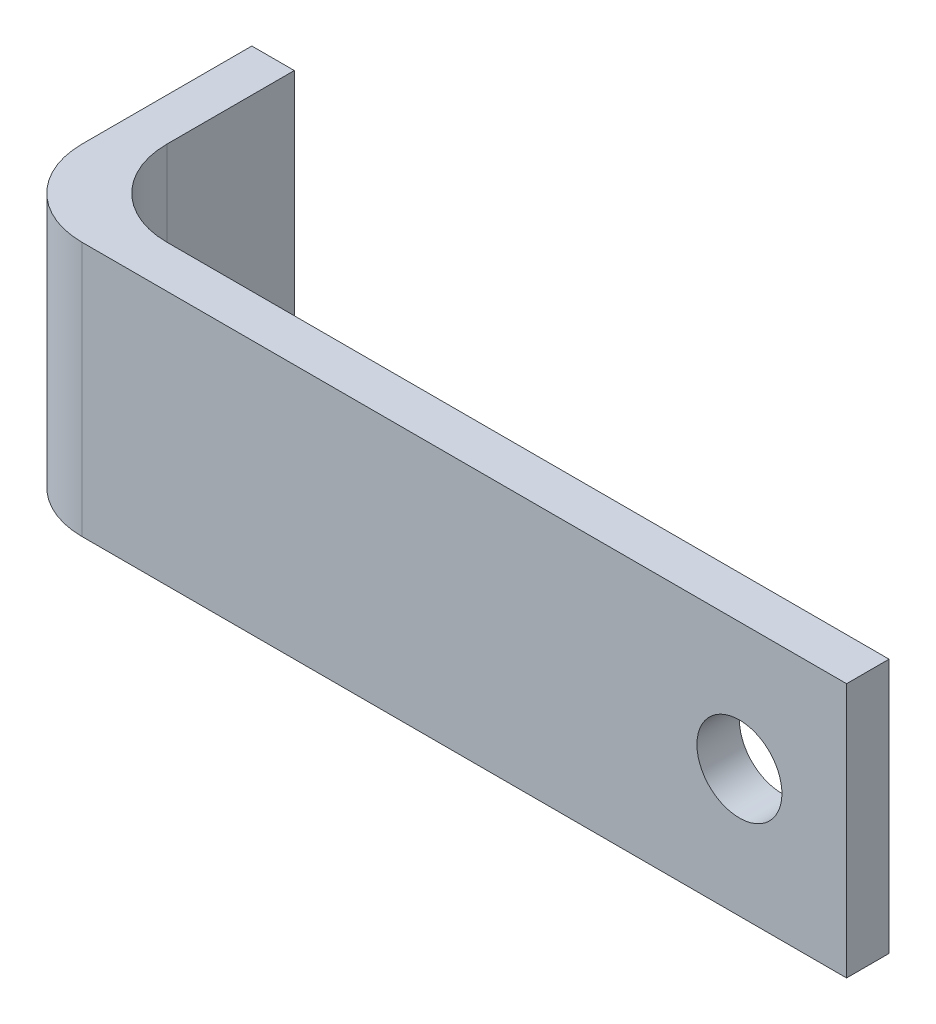
ISO-10303-21;
HEADER;
FILE_DESCRIPTION(('STEP AP214'),'2;1');
FILE_NAME('part.step','',(''),(''),'','','');
FILE_SCHEMA(('AUTOMOTIVE_DESIGN { 1 0 10303 214 1 1 1 1 }'));
ENDSEC;
DATA;
#1=APPLICATION_CONTEXT('core data for automotive mechanical design processes');
#2=APPLICATION_PROTOCOL_DEFINITION('international standard','automotive_design',2000,#1);
#3=PRODUCT_CONTEXT('',#1,'mechanical');
#4=PRODUCT('Part','Part','',(#3));
#5=PRODUCT_RELATED_PRODUCT_CATEGORY('part','',(#4));
#6=PRODUCT_DEFINITION_FORMATION('','',#4);
#7=PRODUCT_DEFINITION_CONTEXT('part definition',#1,'design');
#8=PRODUCT_DEFINITION('design','',#6,#7);
#9=PRODUCT_DEFINITION_SHAPE('','',#8);
#10=(LENGTH_UNIT() NAMED_UNIT(*) SI_UNIT(.MILLI.,.METRE.));
#11=(NAMED_UNIT(*) PLANE_ANGLE_UNIT() SI_UNIT($,.RADIAN.));
#12=(NAMED_UNIT(*) SI_UNIT($,.STERADIAN.) SOLID_ANGLE_UNIT());
#13=UNCERTAINTY_MEASURE_WITH_UNIT(LENGTH_MEASURE(1.E-05),#10,'distance_accuracy_value','');
#14=(GEOMETRIC_REPRESENTATION_CONTEXT(3) GLOBAL_UNCERTAINTY_ASSIGNED_CONTEXT((#13)) GLOBAL_UNIT_ASSIGNED_CONTEXT((#10,
#11,#12)) REPRESENTATION_CONTEXT('',''));
#15=CARTESIAN_POINT('',(0.,0.,0.));
#16=DIRECTION('',(0.,0.,1.));
#17=DIRECTION('',(1.,0.,0.));
#18=AXIS2_PLACEMENT_3D('',#15,#16,#17);
#19=CARTESIAN_POINT('',(-57.3474178403756,15.,9.60093896713609));
#20=DIRECTION('',(1.,0.,0.));
#21=DIRECTION('',(0.,0.,-1.));
#22=AXIS2_PLACEMENT_3D('',#19,#20,#21);
#23=PLANE('',#22);
#24=CARTESIAN_POINT('',(-57.3474178403756,0.,0.));
#25=DIRECTION('',(1.,0.,0.));
#26=DIRECTION('',(0.,0.,-1.));
#27=AXIS2_PLACEMENT_3D('',#24,#25,#26);
#28=CIRCLE('',#27,2.5);
#29=CARTESIAN_POINT('',(-57.3474178403756,0.,-2.49999999999998));
#30=VERTEX_POINT('',#29);
#31=EDGE_CURVE('E11',#30,#30,#28,.F.);
#32=ORIENTED_EDGE('',*,*,#31,.F.);
#33=EDGE_LOOP('',(#32));
#34=FACE_BOUND('',#33,.T.);
#35=DIRECTION('',(0.,0.,1.));
#36=VECTOR('',#35,1.);
#37=CARTESIAN_POINT('',(-57.3474178403756,-15.,9.60093896713609));
#38=LINE('',#37,#36);
#39=CARTESIAN_POINT('',(-57.3474178403756,-15.,-10.3990610328638));
#40=VERTEX_POINT('',#39);
#41=CARTESIAN_POINT('',(-57.3474178403756,-15.,9.60093896713609));
#42=VERTEX_POINT('',#41);
#43=EDGE_CURVE('E141',#40,#42,#38,.T.);
#44=ORIENTED_EDGE('',*,*,#43,.T.);
#45=DIRECTION('',(0.,-1.,0.));
#46=VECTOR('',#45,1.);
#47=CARTESIAN_POINT('',(-57.3474178403756,15.,9.60093896713609));
#48=LINE('',#47,#46);
#49=CARTESIAN_POINT('',(-57.3474178403756,15.,9.60093896713609));
#50=VERTEX_POINT('',#49);
#51=EDGE_CURVE('E48',#50,#42,#48,.T.);
#52=ORIENTED_EDGE('',*,*,#51,.F.);
#53=DIRECTION('',(0.,0.,1.));
#54=VECTOR('',#53,1.);
#55=CARTESIAN_POINT('',(-57.3474178403756,15.,9.60093896713609));
#56=LINE('',#55,#54);
#57=CARTESIAN_POINT('',(-57.3474178403756,15.,-10.3990610328638));
#58=VERTEX_POINT('',#57);
#59=EDGE_CURVE('E164',#58,#50,#56,.T.);
#60=ORIENTED_EDGE('',*,*,#59,.F.);
#61=DIRECTION('',(0.,-1.,0.));
#62=VECTOR('',#61,1.);
#63=CARTESIAN_POINT('',(-57.3474178403756,15.,-10.3990610328638));
#64=LINE('',#63,#62);
#65=EDGE_CURVE('E137',#58,#40,#64,.T.);
#66=ORIENTED_EDGE('',*,*,#65,.T.);
#67=EDGE_LOOP('',(#44,#52,#60,#66));
#68=FACE_BOUND('',#67,.T.);
#69=ADVANCED_FACE('F39',(#34,#68),#23,.F.);
#70=CARTESIAN_POINT('',(-47.3474178403756,15.,9.60093896713616));
#71=DIRECTION('',(0.,-1.,0.));
#72=DIRECTION('',(0.,0.,-1.));
#73=AXIS2_PLACEMENT_3D('',#70,#71,#72);
#74=CYLINDRICAL_SURFACE('',#73,10.);
#75=CARTESIAN_POINT('',(-47.3474178403756,-15.,9.60093896713616));
#76=DIRECTION('',(0.,1.,0.));
#77=DIRECTION('',(0.,0.,1.));
#78=AXIS2_PLACEMENT_3D('',#75,#76,#77);
#79=CIRCLE('',#78,10.);
#80=CARTESIAN_POINT('',(-47.3474178403755,-15.,19.6009389671362));
#81=VERTEX_POINT('',#80);
#82=EDGE_CURVE('E145',#42,#81,#79,.T.);
#83=ORIENTED_EDGE('',*,*,#82,.T.);
#84=DIRECTION('',(0.,-1.,0.));
#85=VECTOR('',#84,1.);
#86=CARTESIAN_POINT('',(-47.3474178403755,15.,19.6009389671362));
#87=LINE('',#86,#85);
#88=CARTESIAN_POINT('',(-47.3474178403755,15.,19.6009389671362));
#89=VERTEX_POINT('',#88);
#90=EDGE_CURVE('E179',#89,#81,#87,.T.);
#91=ORIENTED_EDGE('',*,*,#90,.F.);
#92=CARTESIAN_POINT('',(-47.3474178403756,15.,9.60093896713616));
#93=DIRECTION('',(0.,1.,0.));
#94=DIRECTION('',(0.,0.,1.));
#95=AXIS2_PLACEMENT_3D('',#92,#93,#94);
#96=CIRCLE('',#95,10.);
#97=EDGE_CURVE('E100',#50,#89,#96,.T.);
#98=ORIENTED_EDGE('',*,*,#97,.F.);
#99=ORIENTED_EDGE('',*,*,#51,.T.);
#100=EDGE_LOOP('',(#83,#91,#98,#99));
#101=FACE_BOUND('',#100,.T.);
#102=ADVANCED_FACE('F184',(#101),#74,.T.);
#103=CARTESIAN_POINT('',(42.6525821596244,15.,19.6009389671362));
#104=DIRECTION('',(0.,0.,-1.));
#105=DIRECTION('',(-1.,0.,0.));
#106=AXIS2_PLACEMENT_3D('',#103,#104,#105);
#107=PLANE('',#106);
#108=CARTESIAN_POINT('',(30.0407994786376,0.,19.6009389671362));
#109=DIRECTION('',(0.,0.,-1.));
#110=DIRECTION('',(-1.,0.,0.));
#111=AXIS2_PLACEMENT_3D('',#108,#109,#110);
#112=CIRCLE('',#111,5.);
#113=CARTESIAN_POINT('',(25.0407994786376,0.,19.6009389671362));
#114=VERTEX_POINT('',#113);
#115=EDGE_CURVE('E146',#114,#114,#112,.T.);
#116=ORIENTED_EDGE('',*,*,#115,.T.);
#117=EDGE_LOOP('',(#116));
#118=FACE_BOUND('',#117,.T.);
#119=DIRECTION('',(1.,0.,0.));
#120=VECTOR('',#119,1.);
#121=CARTESIAN_POINT('',(42.6525821596244,-15.,19.6009389671362));
#122=LINE('',#121,#120);
#123=CARTESIAN_POINT('',(42.6525821596244,-15.,19.6009389671362));
#124=VERTEX_POINT('',#123);
#125=EDGE_CURVE('E149',#81,#124,#122,.T.);
#126=ORIENTED_EDGE('',*,*,#125,.T.);
#127=DIRECTION('',(0.,-1.,0.));
#128=VECTOR('',#127,1.);
#129=CARTESIAN_POINT('',(42.6525821596244,15.,19.6009389671362));
#130=LINE('',#129,#128);
#131=CARTESIAN_POINT('',(42.6525821596244,15.,19.6009389671362));
#132=VERTEX_POINT('',#131);
#133=EDGE_CURVE('E175',#132,#124,#130,.T.);
#134=ORIENTED_EDGE('',*,*,#133,.F.);
#135=DIRECTION('',(1.,0.,0.));
#136=VECTOR('',#135,1.);
#137=CARTESIAN_POINT('',(42.6525821596244,15.,19.6009389671362));
#138=LINE('',#137,#136);
#139=EDGE_CURVE('E203',#89,#132,#138,.T.);
#140=ORIENTED_EDGE('',*,*,#139,.F.);
#141=ORIENTED_EDGE('',*,*,#90,.T.);
#142=EDGE_LOOP('',(#126,#134,#140,#141));
#143=FACE_BOUND('',#142,.T.);
#144=ADVANCED_FACE('F195',(#118,#143),#107,.F.);
#145=CARTESIAN_POINT('',(42.6525821596244,15.,14.6009389671362));
#146=DIRECTION('',(-1.,0.,0.));
#147=DIRECTION('',(0.,0.,1.));
#148=AXIS2_PLACEMENT_3D('',#145,#146,#147);
#149=PLANE('',#148);
#150=DIRECTION('',(0.,0.,-1.));
#151=VECTOR('',#150,1.);
#152=CARTESIAN_POINT('',(42.6525821596244,-15.,14.6009389671362));
#153=LINE('',#152,#151);
#154=CARTESIAN_POINT('',(42.6525821596244,-15.,14.6009389671362));
#155=VERTEX_POINT('',#154);
#156=EDGE_CURVE('E152',#124,#155,#153,.T.);
#157=ORIENTED_EDGE('',*,*,#156,.T.);
#158=DIRECTION('',(0.,-1.,0.));
#159=VECTOR('',#158,1.);
#160=CARTESIAN_POINT('',(42.6525821596244,15.,14.6009389671362));
#161=LINE('',#160,#159);
#162=CARTESIAN_POINT('',(42.6525821596244,15.,14.6009389671362));
#163=VERTEX_POINT('',#162);
#164=EDGE_CURVE('E171',#163,#155,#161,.T.);
#165=ORIENTED_EDGE('',*,*,#164,.F.);
#166=DIRECTION('',(0.,0.,-1.));
#167=VECTOR('',#166,1.);
#168=CARTESIAN_POINT('',(42.6525821596244,15.,14.6009389671362));
#169=LINE('',#168,#167);
#170=EDGE_CURVE('E201',#132,#163,#169,.T.);
#171=ORIENTED_EDGE('',*,*,#170,.F.);
#172=ORIENTED_EDGE('',*,*,#133,.T.);
#173=EDGE_LOOP('',(#157,#165,#171,#172));
#174=FACE_BOUND('',#173,.T.);
#175=ADVANCED_FACE('F199',(#174),#149,.F.);
#176=CARTESIAN_POINT('',(-42.3474178403755,15.,14.6009389671362));
#177=DIRECTION('',(0.,0.,1.));
#178=DIRECTION('',(1.,0.,0.));
#179=AXIS2_PLACEMENT_3D('',#176,#177,#178);
#180=PLANE('',#179);
#181=CARTESIAN_POINT('',(30.0407994786376,0.,14.6009389671362));
#182=DIRECTION('',(0.,0.,-1.));
#183=DIRECTION('',(-1.,0.,0.));
#184=AXIS2_PLACEMENT_3D('',#181,#182,#183);
#185=CIRCLE('',#184,5.);
#186=CARTESIAN_POINT('',(25.0407994786376,0.,14.6009389671362));
#187=VERTEX_POINT('',#186);
#188=EDGE_CURVE('E216',#187,#187,#185,.T.);
#189=ORIENTED_EDGE('',*,*,#188,.F.);
#190=EDGE_LOOP('',(#189));
#191=FACE_BOUND('',#190,.T.);
#192=DIRECTION('',(-1.,0.,0.));
#193=VECTOR('',#192,1.);
#194=CARTESIAN_POINT('',(-42.3474178403755,-15.,14.6009389671362));
#195=LINE('',#194,#193);
#196=CARTESIAN_POINT('',(-42.3474178403756,-15.,14.6009389671362));
#197=VERTEX_POINT('',#196);
#198=EDGE_CURVE('E155',#155,#197,#195,.T.);
#199=ORIENTED_EDGE('',*,*,#198,.T.);
#200=DIRECTION('',(0.,-1.,0.));
#201=VECTOR('',#200,1.);
#202=CARTESIAN_POINT('',(-42.3474178403756,15.,14.6009389671362));
#203=LINE('',#202,#201);
#204=CARTESIAN_POINT('',(-42.3474178403756,15.,14.6009389671362));
#205=VERTEX_POINT('',#204);
#206=EDGE_CURVE('E130',#205,#197,#203,.T.);
#207=ORIENTED_EDGE('',*,*,#206,.F.);
#208=DIRECTION('',(-1.,0.,0.));
#209=VECTOR('',#208,1.);
#210=CARTESIAN_POINT('',(-42.3474178403755,15.,14.6009389671362));
#211=LINE('',#210,#209);
#212=EDGE_CURVE('E119',#163,#205,#211,.T.);
#213=ORIENTED_EDGE('',*,*,#212,.F.);
#214=ORIENTED_EDGE('',*,*,#164,.T.);
#215=EDGE_LOOP('',(#199,#207,#213,#214));
#216=FACE_BOUND('',#215,.T.);
#217=ADVANCED_FACE('F246',(#191,#216),#180,.F.);
#218=CARTESIAN_POINT('',(-42.3474178403756,15.,4.60093896713615));
#219=DIRECTION('',(0.,-1.,0.));
#220=DIRECTION('',(0.,0.,-1.));
#221=AXIS2_PLACEMENT_3D('',#218,#219,#220);
#222=CYLINDRICAL_SURFACE('',#221,10.);
#223=CARTESIAN_POINT('',(-42.3474178403756,-15.,4.60093896713615));
#224=DIRECTION('',(0.,-1.,0.));
#225=DIRECTION('',(0.,0.,1.));
#226=AXIS2_PLACEMENT_3D('',#223,#224,#225);
#227=CIRCLE('',#226,10.);
#228=CARTESIAN_POINT('',(-52.3474178403756,-15.,4.60093896713609));
#229=VERTEX_POINT('',#228);
#230=EDGE_CURVE('E128',#197,#229,#227,.T.);
#231=ORIENTED_EDGE('',*,*,#230,.T.);
#232=DIRECTION('',(0.,-1.,0.));
#233=VECTOR('',#232,1.);
#234=CARTESIAN_POINT('',(-52.3474178403756,15.,4.60093896713609));
#235=LINE('',#234,#233);
#236=CARTESIAN_POINT('',(-52.3474178403756,15.,4.60093896713609));
#237=VERTEX_POINT('',#236);
#238=EDGE_CURVE('E125',#237,#229,#235,.T.);
#239=ORIENTED_EDGE('',*,*,#238,.F.);
#240=CARTESIAN_POINT('',(-42.3474178403756,15.,4.60093896713615));
#241=DIRECTION('',(0.,-1.,0.));
#242=DIRECTION('',(0.,0.,1.));
#243=AXIS2_PLACEMENT_3D('',#240,#241,#242);
#244=CIRCLE('',#243,10.);
#245=EDGE_CURVE('E113',#205,#237,#244,.T.);
#246=ORIENTED_EDGE('',*,*,#245,.F.);
#247=ORIENTED_EDGE('',*,*,#206,.T.);
#248=EDGE_LOOP('',(#231,#239,#246,#247));
#249=FACE_BOUND('',#248,.T.);
#250=ADVANCED_FACE('F126',(#249),#222,.F.);
#251=CARTESIAN_POINT('',(-52.3474178403756,15.,-10.3990610328638));
#252=DIRECTION('',(-1.,0.,0.));
#253=DIRECTION('',(0.,0.,1.));
#254=AXIS2_PLACEMENT_3D('',#251,#252,#253);
#255=PLANE('',#254);
#256=DIRECTION('',(0.,0.,-1.));
#257=VECTOR('',#256,1.);
#258=CARTESIAN_POINT('',(-52.3474178403756,-15.,-10.3990610328638));
#259=LINE('',#258,#257);
#260=CARTESIAN_POINT('',(-52.3474178403756,-15.,-10.3990610328638));
#261=VERTEX_POINT('',#260);
#262=EDGE_CURVE('E85',#229,#261,#259,.T.);
#263=ORIENTED_EDGE('',*,*,#262,.T.);
#264=DIRECTION('',(0.,-1.,0.));
#265=VECTOR('',#264,1.);
#266=CARTESIAN_POINT('',(-52.3474178403756,15.,-10.3990610328638));
#267=LINE('',#266,#265);
#268=CARTESIAN_POINT('',(-52.3474178403756,15.,-10.3990610328638));
#269=VERTEX_POINT('',#268);
#270=EDGE_CURVE('E131',#269,#261,#267,.T.);
#271=ORIENTED_EDGE('',*,*,#270,.F.);
#272=DIRECTION('',(0.,0.,-1.));
#273=VECTOR('',#272,1.);
#274=CARTESIAN_POINT('',(-52.3474178403756,15.,-10.3990610328638));
#275=LINE('',#274,#273);
#276=EDGE_CURVE('E117',#237,#269,#275,.T.);
#277=ORIENTED_EDGE('',*,*,#276,.F.);
#278=ORIENTED_EDGE('',*,*,#238,.T.);
#279=EDGE_LOOP('',(#263,#271,#277,#278));
#280=FACE_BOUND('',#279,.T.);
#281=ADVANCED_FACE('F133',(#280),#255,.F.);
#282=CARTESIAN_POINT('',(-57.3474178403756,15.,-10.3990610328638));
#283=DIRECTION('',(0.,0.,1.));
#284=DIRECTION('',(1.,0.,0.));
#285=AXIS2_PLACEMENT_3D('',#282,#283,#284);
#286=PLANE('',#285);
#287=DIRECTION('',(-1.,0.,0.));
#288=VECTOR('',#287,1.);
#289=CARTESIAN_POINT('',(-57.3474178403756,-15.,-10.3990610328638));
#290=LINE('',#289,#288);
#291=EDGE_CURVE('E91',#261,#40,#290,.T.);
#292=ORIENTED_EDGE('',*,*,#291,.T.);
#293=ORIENTED_EDGE('',*,*,#65,.F.);
#294=DIRECTION('',(-1.,0.,0.));
#295=VECTOR('',#294,1.);
#296=CARTESIAN_POINT('',(-57.3474178403756,15.,-10.3990610328638));
#297=LINE('',#296,#295);
#298=EDGE_CURVE('E56',#269,#58,#297,.T.);
#299=ORIENTED_EDGE('',*,*,#298,.F.);
#300=ORIENTED_EDGE('',*,*,#270,.T.);
#301=EDGE_LOOP('',(#292,#293,#299,#300));
#302=FACE_BOUND('',#301,.T.);
#303=ADVANCED_FACE('F254',(#302),#286,.F.);
#304=CARTESIAN_POINT('',(-42.3474178403756,15.,4.60093896713615));
#305=DIRECTION('',(0.,1.,0.));
#306=DIRECTION('',(0.,0.,1.));
#307=AXIS2_PLACEMENT_3D('',#304,#305,#306);
#308=PLANE('',#307);
#309=ORIENTED_EDGE('',*,*,#59,.T.);
#310=ORIENTED_EDGE('',*,*,#97,.T.);
#311=ORIENTED_EDGE('',*,*,#139,.T.);
#312=ORIENTED_EDGE('',*,*,#170,.T.);
#313=ORIENTED_EDGE('',*,*,#212,.T.);
#314=ORIENTED_EDGE('',*,*,#245,.T.);
#315=ORIENTED_EDGE('',*,*,#276,.T.);
#316=ORIENTED_EDGE('',*,*,#298,.T.);
#317=EDGE_LOOP('',(#309,#310,#311,#312,#313,#314,#315,#316));
#318=FACE_BOUND('',#317,.T.);
#319=ADVANCED_FACE('F115',(#318),#308,.T.);
#320=CARTESIAN_POINT('',(-42.3474178403756,-15.,4.60093896713615));
#321=DIRECTION('',(0.,1.,0.));
#322=DIRECTION('',(0.,0.,1.));
#323=AXIS2_PLACEMENT_3D('',#320,#321,#322);
#324=PLANE('',#323);
#325=ORIENTED_EDGE('',*,*,#43,.F.);
#326=ORIENTED_EDGE('',*,*,#291,.F.);
#327=ORIENTED_EDGE('',*,*,#262,.F.);
#328=ORIENTED_EDGE('',*,*,#230,.F.);
#329=ORIENTED_EDGE('',*,*,#198,.F.);
#330=ORIENTED_EDGE('',*,*,#156,.F.);
#331=ORIENTED_EDGE('',*,*,#125,.F.);
#332=ORIENTED_EDGE('',*,*,#82,.F.);
#333=EDGE_LOOP('',(#325,#326,#327,#328,#329,#330,#331,#332));
#334=FACE_BOUND('',#333,.T.);
#335=ADVANCED_FACE('F189',(#334),#324,.F.);
#336=CARTESIAN_POINT('',(30.0407994786376,0.,44.6009389671362));
#337=DIRECTION('',(0.,0.,-1.));
#338=DIRECTION('',(-1.,0.,0.));
#339=AXIS2_PLACEMENT_3D('',#336,#337,#338);
#340=CYLINDRICAL_SURFACE('',#339,5.);
#341=ORIENTED_EDGE('',*,*,#188,.T.);
#342=EDGE_LOOP('',(#341));
#343=FACE_BOUND('',#342,.T.);
#344=ORIENTED_EDGE('',*,*,#115,.F.);
#345=EDGE_LOOP('',(#344));
#346=FACE_BOUND('',#345,.T.);
#347=ADVANCED_FACE('F230',(#343,#346),#340,.F.);
#348=CARTESIAN_POINT('',(-58.3474178403756,0.,0.));
#349=DIRECTION('',(1.,0.,0.));
#350=DIRECTION('',(0.,0.,-1.));
#351=AXIS2_PLACEMENT_3D('',#348,#349,#350);
#352=CYLINDRICAL_SURFACE('',#351,2.5);
#353=CARTESIAN_POINT('',(-58.3474178403756,0.,0.));
#354=DIRECTION('',(-1.,0.,0.));
#355=DIRECTION('',(0.,0.,1.));
#356=AXIS2_PLACEMENT_3D('',#353,#354,#355);
#357=CIRCLE('',#356,2.5);
#358=CARTESIAN_POINT('',(-58.3474178403756,0.,2.50000000000002));
#359=VERTEX_POINT('',#358);
#360=EDGE_CURVE('E220',#359,#359,#357,.T.);
#361=ORIENTED_EDGE('',*,*,#360,.F.);
#362=EDGE_LOOP('',(#361));
#363=FACE_BOUND('',#362,.T.);
#364=ORIENTED_EDGE('',*,*,#31,.T.);
#365=EDGE_LOOP('',(#364));
#366=FACE_BOUND('',#365,.T.);
#367=ADVANCED_FACE('F227',(#363,#366),#352,.T.);
#368=CARTESIAN_POINT('',(-58.3474178403756,0.,0.));
#369=DIRECTION('',(-1.,0.,0.));
#370=DIRECTION('',(0.,0.,1.));
#371=AXIS2_PLACEMENT_3D('',#368,#369,#370);
#372=PLANE('',#371);
#373=ORIENTED_EDGE('',*,*,#360,.T.);
#374=EDGE_LOOP('',(#373));
#375=FACE_BOUND('',#374,.T.);
#376=ADVANCED_FACE('F225',(#375),#372,.T.);
#377=CLOSED_SHELL('',(#69,#102,#144,#175,#217,#250,#281,#303,#319,#335,#347,#367,#376));
#378=MANIFOLD_SOLID_BREP('B2',#377);
#379=ADVANCED_BREP_SHAPE_REPRESENTATION('',(#18,#378),#14);
#380=SHAPE_DEFINITION_REPRESENTATION(#9,#379);
ENDSEC;
END-ISO-10303-21;
